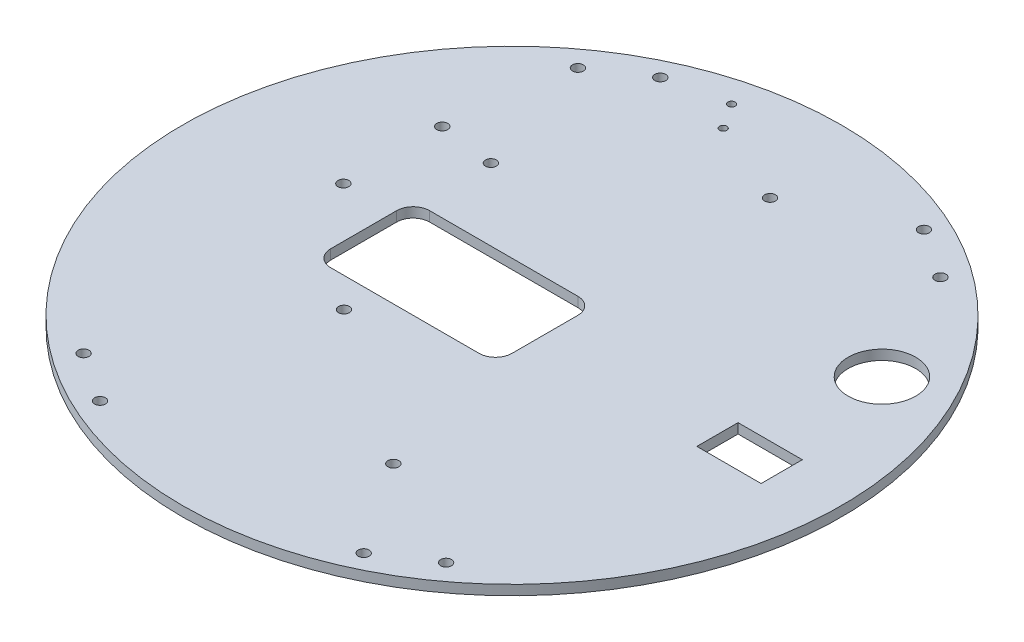
ISO-10303-21;
HEADER;
FILE_DESCRIPTION(('STEP AP214'),'2;1');
FILE_NAME('part.step','',(''),(''),'','','');
FILE_SCHEMA(('AUTOMOTIVE_DESIGN { 1 0 10303 214 1 1 1 1 }'));
ENDSEC;
DATA;
#1=APPLICATION_CONTEXT('core data for automotive mechanical design processes');
#2=APPLICATION_PROTOCOL_DEFINITION('international standard','automotive_design',2000,#1);
#3=PRODUCT_CONTEXT('',#1,'mechanical');
#4=PRODUCT('Part','Part','',(#3));
#5=PRODUCT_RELATED_PRODUCT_CATEGORY('part','',(#4));
#6=PRODUCT_DEFINITION_FORMATION('','',#4);
#7=PRODUCT_DEFINITION_CONTEXT('part definition',#1,'design');
#8=PRODUCT_DEFINITION('design','',#6,#7);
#9=PRODUCT_DEFINITION_SHAPE('','',#8);
#10=(LENGTH_UNIT() NAMED_UNIT(*) SI_UNIT(.MILLI.,.METRE.));
#11=(NAMED_UNIT(*) PLANE_ANGLE_UNIT() SI_UNIT($,.RADIAN.));
#12=(NAMED_UNIT(*) SI_UNIT($,.STERADIAN.) SOLID_ANGLE_UNIT());
#13=UNCERTAINTY_MEASURE_WITH_UNIT(LENGTH_MEASURE(1.E-05),#10,'distance_accuracy_value','');
#14=(GEOMETRIC_REPRESENTATION_CONTEXT(3) GLOBAL_UNCERTAINTY_ASSIGNED_CONTEXT((#13)) GLOBAL_UNIT_ASSIGNED_CONTEXT((#10,
#11,#12)) REPRESENTATION_CONTEXT('',''));
#15=CARTESIAN_POINT('',(0.,0.,0.));
#16=DIRECTION('',(0.,0.,1.));
#17=DIRECTION('',(1.,0.,0.));
#18=AXIS2_PLACEMENT_3D('',#15,#16,#17);
#19=CARTESIAN_POINT('',(0.,3.,0.));
#20=DIRECTION('',(0.,1.,0.));
#21=DIRECTION('',(0.,0.,1.));
#22=AXIS2_PLACEMENT_3D('',#19,#20,#21);
#23=PLANE('',#22);
#24=CARTESIAN_POINT('',(-22.1823925897006,3.,-88.81));
#25=DIRECTION('',(0.,1.,0.));
#26=DIRECTION('',(0.,0.,1.));
#27=AXIS2_PLACEMENT_3D('',#24,#25,#26);
#28=CIRCLE('',#27,1.1);
#29=CARTESIAN_POINT('',(-22.1823925897006,3.,-87.71));
#30=VERTEX_POINT('',#29);
#31=EDGE_CURVE('E172',#30,#30,#28,.T.);
#32=ORIENTED_EDGE('',*,*,#31,.F.);
#33=EDGE_LOOP('',(#32));
#34=FACE_BOUND('',#33,.T.);
#35=CARTESIAN_POINT('',(-40.0000000000001,3.,-85.));
#36=DIRECTION('',(0.,1.,0.));
#37=DIRECTION('',(0.,0.,1.));
#38=AXIS2_PLACEMENT_3D('',#35,#36,#37);
#39=CIRCLE('',#38,1.65);
#40=CARTESIAN_POINT('',(-40.0000000000001,3.,-83.35));
#41=VERTEX_POINT('',#40);
#42=EDGE_CURVE('E184',#41,#41,#39,.T.);
#43=ORIENTED_EDGE('',*,*,#42,.F.);
#44=EDGE_LOOP('',(#43));
#45=FACE_BOUND('',#44,.T.);
#46=CARTESIAN_POINT('',(55.,3.,-75.));
#47=DIRECTION('',(0.,1.,0.));
#48=DIRECTION('',(0.,0.,1.));
#49=AXIS2_PLACEMENT_3D('',#46,#47,#48);
#50=CIRCLE('',#49,1.65);
#51=CARTESIAN_POINT('',(55.,3.,-73.35));
#52=VERTEX_POINT('',#51);
#53=EDGE_CURVE('E196',#52,#52,#50,.T.);
#54=ORIENTED_EDGE('',*,*,#53,.F.);
#55=EDGE_LOOP('',(#54));
#56=FACE_BOUND('',#55,.T.);
#57=CARTESIAN_POINT('',(-43.2023925897006,3.,-36.8));
#58=DIRECTION('',(0.,1.,0.));
#59=DIRECTION('',(0.,0.,1.));
#60=AXIS2_PLACEMENT_3D('',#57,#58,#59);
#61=CIRCLE('',#60,1.65);
#62=CARTESIAN_POINT('',(-43.2023925897006,3.,-35.15));
#63=VERTEX_POINT('',#62);
#64=EDGE_CURVE('E267',#63,#63,#61,.T.);
#65=ORIENTED_EDGE('',*,*,#64,.F.);
#66=EDGE_LOOP('',(#65));
#67=FACE_BOUND('',#66,.T.);
#68=CARTESIAN_POINT('',(72.25,3.,-40.));
#69=DIRECTION('',(0.,1.,0.));
#70=DIRECTION('',(0.,0.,1.));
#71=AXIS2_PLACEMENT_3D('',#68,#69,#70);
#72=CIRCLE('',#71,10.25);
#73=CARTESIAN_POINT('',(72.25,3.,-29.75));
#74=VERTEX_POINT('',#73);
#75=EDGE_CURVE('E279',#74,#74,#72,.T.);
#76=ORIENTED_EDGE('',*,*,#75,.F.);
#77=EDGE_LOOP('',(#76));
#78=FACE_BOUND('',#77,.T.);
#79=CARTESIAN_POINT('',(-55.,3.,75.));
#80=DIRECTION('',(0.,1.,0.));
#81=DIRECTION('',(0.,0.,1.));
#82=AXIS2_PLACEMENT_3D('',#79,#80,#81);
#83=CIRCLE('',#82,1.65);
#84=CARTESIAN_POINT('',(-55.,3.,76.65));
#85=VERTEX_POINT('',#84);
#86=EDGE_CURVE('E291',#85,#85,#83,.T.);
#87=ORIENTED_EDGE('',*,*,#86,.F.);
#88=EDGE_LOOP('',(#87));
#89=FACE_BOUND('',#88,.T.);
#90=CARTESIAN_POINT('',(40.,3.,-85.));
#91=DIRECTION('',(0.,1.,0.));
#92=DIRECTION('',(0.,0.,-1.));
#93=AXIS2_PLACEMENT_3D('',#90,#91,#92);
#94=CIRCLE('',#93,1.65);
#95=CARTESIAN_POINT('',(40.,3.,-86.65));
#96=VERTEX_POINT('',#95);
#97=EDGE_CURVE('E303',#96,#96,#94,.T.);
#98=ORIENTED_EDGE('',*,*,#97,.F.);
#99=EDGE_LOOP('',(#98));
#100=FACE_BOUND('',#99,.T.);
#101=CARTESIAN_POINT('',(-60.2023925897006,3.,-39.0279795935003));
#102=DIRECTION('',(0.,1.,0.));
#103=DIRECTION('',(0.,0.,1.));
#104=AXIS2_PLACEMENT_3D('',#101,#102,#103);
#105=CIRCLE('',#104,1.65);
#106=CARTESIAN_POINT('',(-60.2023925897006,3.,-37.3779795935003));
#107=VERTEX_POINT('',#106);
#108=EDGE_CURVE('E315',#107,#107,#105,.T.);
#109=ORIENTED_EDGE('',*,*,#108,.F.);
#110=EDGE_LOOP('',(#109));
#111=FACE_BOUND('',#110,.T.);
#112=CARTESIAN_POINT('',(0.,3.,0.));
#113=DIRECTION('',(0.,1.,0.));
#114=DIRECTION('',(0.,0.,1.));
#115=AXIS2_PLACEMENT_3D('',#112,#113,#114);
#116=CIRCLE('',#115,100.);
#117=CARTESIAN_POINT('',(0.,3.,100.));
#118=VERTEX_POINT('',#117);
#119=EDGE_CURVE('E11',#118,#118,#116,.T.);
#120=ORIENTED_EDGE('',*,*,#119,.T.);
#121=EDGE_LOOP('',(#120));
#122=FACE_BOUND('',#121,.T.);
#123=CARTESIAN_POINT('',(40.,3.,85.));
#124=DIRECTION('',(0.,1.,0.));
#125=DIRECTION('',(0.,0.,1.));
#126=AXIS2_PLACEMENT_3D('',#123,#124,#125);
#127=CIRCLE('',#126,1.65);
#128=CARTESIAN_POINT('',(40.,3.,86.65));
#129=VERTEX_POINT('',#128);
#130=EDGE_CURVE('E321',#129,#129,#127,.T.);
#131=ORIENTED_EDGE('',*,*,#130,.F.);
#132=EDGE_LOOP('',(#131));
#133=FACE_BOUND('',#132,.T.);
#134=CARTESIAN_POINT('',(-60.2023925897006,3.,-9.02797959350035));
#135=DIRECTION('',(0.,1.,0.));
#136=DIRECTION('',(0.,0.,1.));
#137=AXIS2_PLACEMENT_3D('',#134,#135,#136);
#138=CIRCLE('',#137,1.64999999999997);
#139=CARTESIAN_POINT('',(-60.2023925897006,3.,-7.37797959350038));
#140=VERTEX_POINT('',#139);
#141=EDGE_CURVE('E309',#140,#140,#138,.T.);
#142=ORIENTED_EDGE('',*,*,#141,.F.);
#143=EDGE_LOOP('',(#142));
#144=FACE_BOUND('',#143,.T.);
#145=CARTESIAN_POINT('',(-40.,3.,85.));
#146=DIRECTION('',(0.,1.,0.));
#147=DIRECTION('',(0.,0.,-1.));
#148=AXIS2_PLACEMENT_3D('',#145,#146,#147);
#149=CIRCLE('',#148,1.65);
#150=CARTESIAN_POINT('',(-40.,3.,83.35));
#151=VERTEX_POINT('',#150);
#152=EDGE_CURVE('E297',#151,#151,#149,.T.);
#153=ORIENTED_EDGE('',*,*,#152,.F.);
#154=EDGE_LOOP('',(#153));
#155=FACE_BOUND('',#154,.T.);
#156=CARTESIAN_POINT('',(21.,3.,57.));
#157=DIRECTION('',(0.,1.,0.));
#158=DIRECTION('',(0.,0.,-1.));
#159=AXIS2_PLACEMENT_3D('',#156,#157,#158);
#160=CIRCLE('',#159,1.65);
#161=CARTESIAN_POINT('',(21.,3.,55.35));
#162=VERTEX_POINT('',#161);
#163=EDGE_CURVE('E285',#162,#162,#160,.T.);
#164=ORIENTED_EDGE('',*,*,#163,.F.);
#165=EDGE_LOOP('',(#164));
#166=FACE_BOUND('',#165,.T.);
#167=CARTESIAN_POINT('',(-27.,3.,24.));
#168=DIRECTION('',(0.,1.,0.));
#169=DIRECTION('',(0.,0.,-1.));
#170=AXIS2_PLACEMENT_3D('',#167,#168,#169);
#171=CIRCLE('',#170,1.65);
#172=CARTESIAN_POINT('',(-27.,3.,22.35));
#173=VERTEX_POINT('',#172);
#174=EDGE_CURVE('E273',#173,#173,#171,.T.);
#175=ORIENTED_EDGE('',*,*,#174,.F.);
#176=EDGE_LOOP('',(#175));
#177=FACE_BOUND('',#176,.T.);
#178=CARTESIAN_POINT('',(8.29760741029937,3.,-70.));
#179=DIRECTION('',(0.,1.,0.));
#180=DIRECTION('',(0.,0.,1.));
#181=AXIS2_PLACEMENT_3D('',#178,#179,#180);
#182=CIRCLE('',#181,1.65);
#183=CARTESIAN_POINT('',(8.29760741029937,3.,-68.35));
#184=VERTEX_POINT('',#183);
#185=EDGE_CURVE('E261',#184,#184,#182,.T.);
#186=ORIENTED_EDGE('',*,*,#185,.F.);
#187=EDGE_LOOP('',(#186));
#188=FACE_BOUND('',#187,.T.);
#189=DIRECTION('',(-1.,0.,0.));
#190=VECTOR('',#189,1.);
#191=CARTESIAN_POINT('',(-40.,3.,-15.));
#192=LINE('',#191,#190);
#193=CARTESIAN_POINT('',(5.,3.,-15.));
#194=VERTEX_POINT('',#193);
#195=CARTESIAN_POINT('',(-40.,3.,-15.));
#196=VERTEX_POINT('',#195);
#197=EDGE_CURVE('E204',#194,#196,#192,.T.);
#198=ORIENTED_EDGE('',*,*,#197,.F.);
#199=CARTESIAN_POINT('',(5.,3.,-10.));
#200=DIRECTION('',(0.,1.,0.));
#201=DIRECTION('',(0.,0.,-1.));
#202=AXIS2_PLACEMENT_3D('',#199,#200,#201);
#203=CIRCLE('',#202,5.);
#204=CARTESIAN_POINT('',(10.,3.,-10.));
#205=VERTEX_POINT('',#204);
#206=EDGE_CURVE('E202',#205,#194,#203,.T.);
#207=ORIENTED_EDGE('',*,*,#206,.F.);
#208=DIRECTION('',(0.,0.,-1.));
#209=VECTOR('',#208,1.);
#210=CARTESIAN_POINT('',(10.,3.,-10.));
#211=LINE('',#210,#209);
#212=CARTESIAN_POINT('',(10.,3.,10.));
#213=VERTEX_POINT('',#212);
#214=EDGE_CURVE('E218',#213,#205,#211,.T.);
#215=ORIENTED_EDGE('',*,*,#214,.F.);
#216=CARTESIAN_POINT('',(5.,3.,10.));
#217=DIRECTION('',(0.,1.,0.));
#218=DIRECTION('',(0.,0.,1.));
#219=AXIS2_PLACEMENT_3D('',#216,#217,#218);
#220=CIRCLE('',#219,5.);
#221=CARTESIAN_POINT('',(5.,3.,15.));
#222=VERTEX_POINT('',#221);
#223=EDGE_CURVE('E215',#222,#213,#220,.T.);
#224=ORIENTED_EDGE('',*,*,#223,.F.);
#225=DIRECTION('',(1.,0.,0.));
#226=VECTOR('',#225,1.);
#227=CARTESIAN_POINT('',(-40.,3.,15.));
#228=LINE('',#227,#226);
#229=CARTESIAN_POINT('',(-40.,3.,15.));
#230=VERTEX_POINT('',#229);
#231=EDGE_CURVE('E213',#230,#222,#228,.T.);
#232=ORIENTED_EDGE('',*,*,#231,.F.);
#233=CARTESIAN_POINT('',(-40.,3.,10.));
#234=DIRECTION('',(0.,1.,0.));
#235=DIRECTION('',(0.,0.,1.));
#236=AXIS2_PLACEMENT_3D('',#233,#234,#235);
#237=CIRCLE('',#236,5.);
#238=CARTESIAN_POINT('',(-45.,3.,10.));
#239=VERTEX_POINT('',#238);
#240=EDGE_CURVE('E211',#239,#230,#237,.T.);
#241=ORIENTED_EDGE('',*,*,#240,.F.);
#242=DIRECTION('',(0.,0.,1.));
#243=VECTOR('',#242,1.);
#244=CARTESIAN_POINT('',(-45.,3.,-10.));
#245=LINE('',#244,#243);
#246=CARTESIAN_POINT('',(-45.,3.,-10.));
#247=VERTEX_POINT('',#246);
#248=EDGE_CURVE('E209',#247,#239,#245,.T.);
#249=ORIENTED_EDGE('',*,*,#248,.F.);
#250=CARTESIAN_POINT('',(-40.,3.,-10.));
#251=DIRECTION('',(0.,1.,0.));
#252=DIRECTION('',(0.,0.,1.));
#253=AXIS2_PLACEMENT_3D('',#250,#251,#252);
#254=CIRCLE('',#253,5.);
#255=EDGE_CURVE('E207',#196,#247,#254,.T.);
#256=ORIENTED_EDGE('',*,*,#255,.F.);
#257=EDGE_LOOP('',(#198,#207,#215,#224,#232,#241,#249,#256));
#258=FACE_BOUND('',#257,.T.);
#259=CARTESIAN_POINT('',(-55.,3.,-75.));
#260=DIRECTION('',(0.,1.,0.));
#261=DIRECTION('',(0.,0.,-1.));
#262=AXIS2_PLACEMENT_3D('',#259,#260,#261);
#263=CIRCLE('',#262,1.65);
#264=CARTESIAN_POINT('',(-55.,3.,-76.65));
#265=VERTEX_POINT('',#264);
#266=EDGE_CURVE('E190',#265,#265,#263,.T.);
#267=ORIENTED_EDGE('',*,*,#266,.F.);
#268=EDGE_LOOP('',(#267));
#269=FACE_BOUND('',#268,.T.);
#270=CARTESIAN_POINT('',(55.,3.,75.));
#271=DIRECTION('',(0.,1.,0.));
#272=DIRECTION('',(0.,0.,-1.));
#273=AXIS2_PLACEMENT_3D('',#270,#271,#272);
#274=CIRCLE('',#273,1.65);
#275=CARTESIAN_POINT('',(55.,3.,73.35));
#276=VERTEX_POINT('',#275);
#277=EDGE_CURVE('E178',#276,#276,#274,.T.);
#278=ORIENTED_EDGE('',*,*,#277,.F.);
#279=EDGE_LOOP('',(#278));
#280=FACE_BOUND('',#279,.T.);
#281=CARTESIAN_POINT('',(-17.1023925897006,3.,-81.19));
#282=DIRECTION('',(0.,1.,0.));
#283=DIRECTION('',(0.,0.,1.));
#284=AXIS2_PLACEMENT_3D('',#281,#282,#283);
#285=CIRCLE('',#284,1.1);
#286=CARTESIAN_POINT('',(-17.1023925897006,3.,-80.09));
#287=VERTEX_POINT('',#286);
#288=EDGE_CURVE('E166',#287,#287,#285,.T.);
#289=ORIENTED_EDGE('',*,*,#288,.F.);
#290=EDGE_LOOP('',(#289));
#291=FACE_BOUND('',#290,.T.);
#292=DIRECTION('',(1.,0.,0.));
#293=VECTOR('',#292,1.);
#294=CARTESIAN_POINT('',(62.5,3.,6.40853409758088));
#295=LINE('',#294,#293);
#296=CARTESIAN_POINT('',(62.5,3.,6.40853409758088));
#297=VERTEX_POINT('',#296);
#298=CARTESIAN_POINT('',(82.,3.,6.40853409758088));
#299=VERTEX_POINT('',#298);
#300=EDGE_CURVE('E138',#297,#299,#295,.T.);
#301=ORIENTED_EDGE('',*,*,#300,.F.);
#302=DIRECTION('',(0.,0.,1.));
#303=VECTOR('',#302,1.);
#304=CARTESIAN_POINT('',(62.5,3.,-6.09146590241912));
#305=LINE('',#304,#303);
#306=CARTESIAN_POINT('',(62.5,3.,-6.09146590241912));
#307=VERTEX_POINT('',#306);
#308=EDGE_CURVE('E130',#307,#297,#305,.T.);
#309=ORIENTED_EDGE('',*,*,#308,.F.);
#310=DIRECTION('',(-1.,0.,0.));
#311=VECTOR('',#310,1.);
#312=CARTESIAN_POINT('',(62.5,3.,-6.09146590241912));
#313=LINE('',#312,#311);
#314=CARTESIAN_POINT('',(82.,3.,-6.09146590241912));
#315=VERTEX_POINT('',#314);
#316=EDGE_CURVE('E152',#315,#307,#313,.T.);
#317=ORIENTED_EDGE('',*,*,#316,.F.);
#318=DIRECTION('',(0.,0.,-1.));
#319=VECTOR('',#318,1.);
#320=CARTESIAN_POINT('',(82.,3.,-6.09146590241912));
#321=LINE('',#320,#319);
#322=EDGE_CURVE('E150',#299,#315,#321,.T.);
#323=ORIENTED_EDGE('',*,*,#322,.F.);
#324=EDGE_LOOP('',(#301,#309,#317,#323));
#325=FACE_BOUND('',#324,.T.);
#326=ADVANCED_FACE('F41',(#34,#45,#56,#67,#78,#89,#100,#111,#122,#133,#144,#155,#166,#177,#188,
#258,#269,#280,#291,#325),#23,.T.);
#327=CARTESIAN_POINT('',(0.,0.,0.));
#328=DIRECTION('',(0.,1.,0.));
#329=DIRECTION('',(0.,0.,1.));
#330=AXIS2_PLACEMENT_3D('',#327,#328,#329);
#331=PLANE('',#330);
#332=CARTESIAN_POINT('',(-17.1023925897006,0.,-81.19));
#333=DIRECTION('',(0.,1.,0.));
#334=DIRECTION('',(0.,0.,1.));
#335=AXIS2_PLACEMENT_3D('',#332,#333,#334);
#336=CIRCLE('',#335,1.1);
#337=CARTESIAN_POINT('',(-17.1023925897006,0.,-80.09));
#338=VERTEX_POINT('',#337);
#339=EDGE_CURVE('E146',#338,#338,#336,.T.);
#340=ORIENTED_EDGE('',*,*,#339,.T.);
#341=EDGE_LOOP('',(#340));
#342=FACE_BOUND('',#341,.T.);
#343=CARTESIAN_POINT('',(-22.1823925897006,0.,-88.81));
#344=DIRECTION('',(0.,1.,0.));
#345=DIRECTION('',(0.,0.,1.));
#346=AXIS2_PLACEMENT_3D('',#343,#344,#345);
#347=CIRCLE('',#346,1.1);
#348=CARTESIAN_POINT('',(-22.1823925897006,0.,-87.71));
#349=VERTEX_POINT('',#348);
#350=EDGE_CURVE('E169',#349,#349,#347,.T.);
#351=ORIENTED_EDGE('',*,*,#350,.T.);
#352=EDGE_LOOP('',(#351));
#353=FACE_BOUND('',#352,.T.);
#354=CARTESIAN_POINT('',(55.,0.,75.));
#355=DIRECTION('',(0.,1.,0.));
#356=DIRECTION('',(0.,0.,-1.));
#357=AXIS2_PLACEMENT_3D('',#354,#355,#356);
#358=CIRCLE('',#357,1.65);
#359=CARTESIAN_POINT('',(55.,0.,73.35));
#360=VERTEX_POINT('',#359);
#361=EDGE_CURVE('E175',#360,#360,#358,.T.);
#362=ORIENTED_EDGE('',*,*,#361,.T.);
#363=EDGE_LOOP('',(#362));
#364=FACE_BOUND('',#363,.T.);
#365=CARTESIAN_POINT('',(-40.0000000000001,0.,-85.));
#366=DIRECTION('',(0.,1.,0.));
#367=DIRECTION('',(0.,0.,1.));
#368=AXIS2_PLACEMENT_3D('',#365,#366,#367);
#369=CIRCLE('',#368,1.65);
#370=CARTESIAN_POINT('',(-40.0000000000001,0.,-83.35));
#371=VERTEX_POINT('',#370);
#372=EDGE_CURVE('E181',#371,#371,#369,.T.);
#373=ORIENTED_EDGE('',*,*,#372,.T.);
#374=EDGE_LOOP('',(#373));
#375=FACE_BOUND('',#374,.T.);
#376=CARTESIAN_POINT('',(-55.,0.,-75.));
#377=DIRECTION('',(0.,1.,0.));
#378=DIRECTION('',(0.,0.,-1.));
#379=AXIS2_PLACEMENT_3D('',#376,#377,#378);
#380=CIRCLE('',#379,1.65);
#381=CARTESIAN_POINT('',(-55.,0.,-76.65));
#382=VERTEX_POINT('',#381);
#383=EDGE_CURVE('E187',#382,#382,#380,.T.);
#384=ORIENTED_EDGE('',*,*,#383,.T.);
#385=EDGE_LOOP('',(#384));
#386=FACE_BOUND('',#385,.T.);
#387=CARTESIAN_POINT('',(55.,0.,-75.));
#388=DIRECTION('',(0.,1.,0.));
#389=DIRECTION('',(0.,0.,1.));
#390=AXIS2_PLACEMENT_3D('',#387,#388,#389);
#391=CIRCLE('',#390,1.65);
#392=CARTESIAN_POINT('',(55.,0.,-73.35));
#393=VERTEX_POINT('',#392);
#394=EDGE_CURVE('E193',#393,#393,#391,.T.);
#395=ORIENTED_EDGE('',*,*,#394,.T.);
#396=EDGE_LOOP('',(#395));
#397=FACE_BOUND('',#396,.T.);
#398=CARTESIAN_POINT('',(5.,0.,-10.));
#399=DIRECTION('',(0.,1.,0.));
#400=DIRECTION('',(0.,0.,-1.));
#401=AXIS2_PLACEMENT_3D('',#398,#399,#400);
#402=CIRCLE('',#401,5.);
#403=CARTESIAN_POINT('',(10.,0.,-10.));
#404=VERTEX_POINT('',#403);
#405=CARTESIAN_POINT('',(5.,0.,-15.));
#406=VERTEX_POINT('',#405);
#407=EDGE_CURVE('E199',#404,#406,#402,.T.);
#408=ORIENTED_EDGE('',*,*,#407,.T.);
#409=DIRECTION('',(-1.,0.,0.));
#410=VECTOR('',#409,1.);
#411=CARTESIAN_POINT('',(-40.,0.,-15.));
#412=LINE('',#411,#410);
#413=CARTESIAN_POINT('',(-40.,0.,-15.));
#414=VERTEX_POINT('',#413);
#415=EDGE_CURVE('E223',#406,#414,#412,.T.);
#416=ORIENTED_EDGE('',*,*,#415,.T.);
#417=CARTESIAN_POINT('',(-40.,0.,-10.));
#418=DIRECTION('',(0.,1.,0.));
#419=DIRECTION('',(0.,0.,1.));
#420=AXIS2_PLACEMENT_3D('',#417,#418,#419);
#421=CIRCLE('',#420,5.);
#422=CARTESIAN_POINT('',(-45.,0.,-10.));
#423=VERTEX_POINT('',#422);
#424=EDGE_CURVE('E226',#414,#423,#421,.T.);
#425=ORIENTED_EDGE('',*,*,#424,.T.);
#426=DIRECTION('',(0.,0.,1.));
#427=VECTOR('',#426,1.);
#428=CARTESIAN_POINT('',(-45.,0.,-10.));
#429=LINE('',#428,#427);
#430=CARTESIAN_POINT('',(-45.,0.,10.));
#431=VERTEX_POINT('',#430);
#432=EDGE_CURVE('E229',#423,#431,#429,.T.);
#433=ORIENTED_EDGE('',*,*,#432,.T.);
#434=CARTESIAN_POINT('',(-40.,0.,10.));
#435=DIRECTION('',(0.,1.,0.));
#436=DIRECTION('',(0.,0.,1.));
#437=AXIS2_PLACEMENT_3D('',#434,#435,#436);
#438=CIRCLE('',#437,5.);
#439=CARTESIAN_POINT('',(-40.,0.,15.));
#440=VERTEX_POINT('',#439);
#441=EDGE_CURVE('E232',#431,#440,#438,.T.);
#442=ORIENTED_EDGE('',*,*,#441,.T.);
#443=DIRECTION('',(1.,0.,0.));
#444=VECTOR('',#443,1.);
#445=CARTESIAN_POINT('',(-40.,0.,15.));
#446=LINE('',#445,#444);
#447=CARTESIAN_POINT('',(5.,0.,15.));
#448=VERTEX_POINT('',#447);
#449=EDGE_CURVE('E235',#440,#448,#446,.T.);
#450=ORIENTED_EDGE('',*,*,#449,.T.);
#451=CARTESIAN_POINT('',(5.,0.,10.));
#452=DIRECTION('',(0.,1.,0.));
#453=DIRECTION('',(0.,0.,1.));
#454=AXIS2_PLACEMENT_3D('',#451,#452,#453);
#455=CIRCLE('',#454,5.);
#456=CARTESIAN_POINT('',(10.,0.,10.));
#457=VERTEX_POINT('',#456);
#458=EDGE_CURVE('E238',#448,#457,#455,.T.);
#459=ORIENTED_EDGE('',*,*,#458,.T.);
#460=DIRECTION('',(0.,0.,-1.));
#461=VECTOR('',#460,1.);
#462=CARTESIAN_POINT('',(10.,0.,-10.));
#463=LINE('',#462,#461);
#464=EDGE_CURVE('E205',#457,#404,#463,.T.);
#465=ORIENTED_EDGE('',*,*,#464,.T.);
#466=EDGE_LOOP('',(#408,#416,#425,#433,#442,#450,#459,#465));
#467=FACE_BOUND('',#466,.T.);
#468=CARTESIAN_POINT('',(0.,0.,0.));
#469=DIRECTION('',(0.,1.,0.));
#470=DIRECTION('',(0.,0.,1.));
#471=AXIS2_PLACEMENT_3D('',#468,#469,#470);
#472=CIRCLE('',#471,100.);
#473=CARTESIAN_POINT('',(0.,0.,100.));
#474=VERTEX_POINT('',#473);
#475=EDGE_CURVE('E45',#474,#474,#472,.T.);
#476=ORIENTED_EDGE('',*,*,#475,.F.);
#477=EDGE_LOOP('',(#476));
#478=FACE_BOUND('',#477,.T.);
#479=CARTESIAN_POINT('',(40.,0.,85.));
#480=DIRECTION('',(0.,1.,0.));
#481=DIRECTION('',(0.,0.,1.));
#482=AXIS2_PLACEMENT_3D('',#479,#480,#481);
#483=CIRCLE('',#482,1.65);
#484=CARTESIAN_POINT('',(40.,0.,86.65));
#485=VERTEX_POINT('',#484);
#486=EDGE_CURVE('E318',#485,#485,#483,.T.);
#487=ORIENTED_EDGE('',*,*,#486,.T.);
#488=EDGE_LOOP('',(#487));
#489=FACE_BOUND('',#488,.T.);
#490=CARTESIAN_POINT('',(-60.2023925897006,0.,-39.0279795935003));
#491=DIRECTION('',(0.,1.,0.));
#492=DIRECTION('',(0.,0.,1.));
#493=AXIS2_PLACEMENT_3D('',#490,#491,#492);
#494=CIRCLE('',#493,1.65);
#495=CARTESIAN_POINT('',(-60.2023925897006,0.,-37.3779795935003));
#496=VERTEX_POINT('',#495);
#497=EDGE_CURVE('E312',#496,#496,#494,.T.);
#498=ORIENTED_EDGE('',*,*,#497,.T.);
#499=EDGE_LOOP('',(#498));
#500=FACE_BOUND('',#499,.T.);
#501=CARTESIAN_POINT('',(-60.2023925897006,0.,-9.02797959350035));
#502=DIRECTION('',(0.,1.,0.));
#503=DIRECTION('',(0.,0.,1.));
#504=AXIS2_PLACEMENT_3D('',#501,#502,#503);
#505=CIRCLE('',#504,1.64999999999997);
#506=CARTESIAN_POINT('',(-60.2023925897006,0.,-7.37797959350038));
#507=VERTEX_POINT('',#506);
#508=EDGE_CURVE('E306',#507,#507,#505,.T.);
#509=ORIENTED_EDGE('',*,*,#508,.T.);
#510=EDGE_LOOP('',(#509));
#511=FACE_BOUND('',#510,.T.);
#512=CARTESIAN_POINT('',(40.,0.,-85.));
#513=DIRECTION('',(0.,1.,0.));
#514=DIRECTION('',(0.,0.,-1.));
#515=AXIS2_PLACEMENT_3D('',#512,#513,#514);
#516=CIRCLE('',#515,1.65);
#517=CARTESIAN_POINT('',(40.,0.,-86.65));
#518=VERTEX_POINT('',#517);
#519=EDGE_CURVE('E300',#518,#518,#516,.T.);
#520=ORIENTED_EDGE('',*,*,#519,.T.);
#521=EDGE_LOOP('',(#520));
#522=FACE_BOUND('',#521,.T.);
#523=CARTESIAN_POINT('',(-40.,0.,85.));
#524=DIRECTION('',(0.,1.,0.));
#525=DIRECTION('',(0.,0.,-1.));
#526=AXIS2_PLACEMENT_3D('',#523,#524,#525);
#527=CIRCLE('',#526,1.65);
#528=CARTESIAN_POINT('',(-40.,0.,83.35));
#529=VERTEX_POINT('',#528);
#530=EDGE_CURVE('E294',#529,#529,#527,.T.);
#531=ORIENTED_EDGE('',*,*,#530,.T.);
#532=EDGE_LOOP('',(#531));
#533=FACE_BOUND('',#532,.T.);
#534=CARTESIAN_POINT('',(-55.,0.,75.));
#535=DIRECTION('',(0.,1.,0.));
#536=DIRECTION('',(0.,0.,1.));
#537=AXIS2_PLACEMENT_3D('',#534,#535,#536);
#538=CIRCLE('',#537,1.65);
#539=CARTESIAN_POINT('',(-55.,0.,76.65));
#540=VERTEX_POINT('',#539);
#541=EDGE_CURVE('E288',#540,#540,#538,.T.);
#542=ORIENTED_EDGE('',*,*,#541,.T.);
#543=EDGE_LOOP('',(#542));
#544=FACE_BOUND('',#543,.T.);
#545=CARTESIAN_POINT('',(21.,0.,57.));
#546=DIRECTION('',(0.,1.,0.));
#547=DIRECTION('',(0.,0.,-1.));
#548=AXIS2_PLACEMENT_3D('',#545,#546,#547);
#549=CIRCLE('',#548,1.65);
#550=CARTESIAN_POINT('',(21.,0.,55.35));
#551=VERTEX_POINT('',#550);
#552=EDGE_CURVE('E282',#551,#551,#549,.T.);
#553=ORIENTED_EDGE('',*,*,#552,.T.);
#554=EDGE_LOOP('',(#553));
#555=FACE_BOUND('',#554,.T.);
#556=CARTESIAN_POINT('',(72.25,0.,-40.));
#557=DIRECTION('',(0.,1.,0.));
#558=DIRECTION('',(0.,0.,1.));
#559=AXIS2_PLACEMENT_3D('',#556,#557,#558);
#560=CIRCLE('',#559,10.25);
#561=CARTESIAN_POINT('',(72.25,0.,-29.75));
#562=VERTEX_POINT('',#561);
#563=EDGE_CURVE('E276',#562,#562,#560,.T.);
#564=ORIENTED_EDGE('',*,*,#563,.T.);
#565=EDGE_LOOP('',(#564));
#566=FACE_BOUND('',#565,.T.);
#567=CARTESIAN_POINT('',(-27.,0.,24.));
#568=DIRECTION('',(0.,1.,0.));
#569=DIRECTION('',(0.,0.,-1.));
#570=AXIS2_PLACEMENT_3D('',#567,#568,#569);
#571=CIRCLE('',#570,1.65);
#572=CARTESIAN_POINT('',(-27.,0.,22.35));
#573=VERTEX_POINT('',#572);
#574=EDGE_CURVE('E270',#573,#573,#571,.T.);
#575=ORIENTED_EDGE('',*,*,#574,.T.);
#576=EDGE_LOOP('',(#575));
#577=FACE_BOUND('',#576,.T.);
#578=CARTESIAN_POINT('',(-43.2023925897006,0.,-36.8));
#579=DIRECTION('',(0.,1.,0.));
#580=DIRECTION('',(0.,0.,1.));
#581=AXIS2_PLACEMENT_3D('',#578,#579,#580);
#582=CIRCLE('',#581,1.65);
#583=CARTESIAN_POINT('',(-43.2023925897006,0.,-35.15));
#584=VERTEX_POINT('',#583);
#585=EDGE_CURVE('E264',#584,#584,#582,.T.);
#586=ORIENTED_EDGE('',*,*,#585,.T.);
#587=EDGE_LOOP('',(#586));
#588=FACE_BOUND('',#587,.T.);
#589=CARTESIAN_POINT('',(8.29760741029937,0.,-70.));
#590=DIRECTION('',(0.,1.,0.));
#591=DIRECTION('',(0.,0.,1.));
#592=AXIS2_PLACEMENT_3D('',#589,#590,#591);
#593=CIRCLE('',#592,1.65);
#594=CARTESIAN_POINT('',(8.29760741029937,0.,-68.35));
#595=VERTEX_POINT('',#594);
#596=EDGE_CURVE('E260',#595,#595,#593,.T.);
#597=ORIENTED_EDGE('',*,*,#596,.T.);
#598=EDGE_LOOP('',(#597));
#599=FACE_BOUND('',#598,.T.);
#600=DIRECTION('',(0.,0.,1.));
#601=VECTOR('',#600,1.);
#602=CARTESIAN_POINT('',(62.5,0.,-6.09146590241912));
#603=LINE('',#602,#601);
#604=CARTESIAN_POINT('',(62.5,0.,-6.09146590241912));
#605=VERTEX_POINT('',#604);
#606=CARTESIAN_POINT('',(62.5,0.,6.40853409758088));
#607=VERTEX_POINT('',#606);
#608=EDGE_CURVE('E64',#605,#607,#603,.T.);
#609=ORIENTED_EDGE('',*,*,#608,.T.);
#610=DIRECTION('',(1.,0.,0.));
#611=VECTOR('',#610,1.);
#612=CARTESIAN_POINT('',(62.5,0.,6.40853409758088));
#613=LINE('',#612,#611);
#614=CARTESIAN_POINT('',(82.,0.,6.40853409758088));
#615=VERTEX_POINT('',#614);
#616=EDGE_CURVE('E145',#607,#615,#613,.T.);
#617=ORIENTED_EDGE('',*,*,#616,.T.);
#618=DIRECTION('',(0.,0.,-1.));
#619=VECTOR('',#618,1.);
#620=CARTESIAN_POINT('',(82.,0.,-6.09146590241912));
#621=LINE('',#620,#619);
#622=CARTESIAN_POINT('',(82.,0.,-6.09146590241912));
#623=VERTEX_POINT('',#622);
#624=EDGE_CURVE('E158',#615,#623,#621,.T.);
#625=ORIENTED_EDGE('',*,*,#624,.T.);
#626=DIRECTION('',(-1.,0.,0.));
#627=VECTOR('',#626,1.);
#628=CARTESIAN_POINT('',(62.5,0.,-6.09146590241912));
#629=LINE('',#628,#627);
#630=EDGE_CURVE('E139',#623,#605,#629,.T.);
#631=ORIENTED_EDGE('',*,*,#630,.T.);
#632=EDGE_LOOP('',(#609,#617,#625,#631));
#633=FACE_BOUND('',#632,.T.);
#634=ADVANCED_FACE('F327',(#342,#353,#364,#375,#386,#397,#467,#478,#489,#500,#511,#522,#533,
#544,#555,#566,#577,#588,#599,#633),#331,.F.);
#635=CARTESIAN_POINT('',(0.,3.,0.));
#636=DIRECTION('',(0.,-1.,0.));
#637=DIRECTION('',(0.,0.,-1.));
#638=AXIS2_PLACEMENT_3D('',#635,#636,#637);
#639=CYLINDRICAL_SURFACE('',#638,100.);
#640=ORIENTED_EDGE('',*,*,#119,.F.);
#641=EDGE_LOOP('',(#640));
#642=FACE_BOUND('',#641,.T.);
#643=ORIENTED_EDGE('',*,*,#475,.T.);
#644=EDGE_LOOP('',(#643));
#645=FACE_BOUND('',#644,.T.);
#646=ADVANCED_FACE('F43',(#642,#645),#639,.T.);
#647=CARTESIAN_POINT('',(40.,3.,85.));
#648=DIRECTION('',(0.,-1.,0.));
#649=DIRECTION('',(0.,0.,-1.));
#650=AXIS2_PLACEMENT_3D('',#647,#648,#649);
#651=CYLINDRICAL_SURFACE('',#650,1.65);
#652=ORIENTED_EDGE('',*,*,#130,.T.);
#653=EDGE_LOOP('',(#652));
#654=FACE_BOUND('',#653,.T.);
#655=ORIENTED_EDGE('',*,*,#486,.F.);
#656=EDGE_LOOP('',(#655));
#657=FACE_BOUND('',#656,.T.);
#658=ADVANCED_FACE('F330',(#654,#657),#651,.F.);
#659=CARTESIAN_POINT('',(-60.2023925897006,3.,-39.0279795935003));
#660=DIRECTION('',(0.,-1.,0.));
#661=DIRECTION('',(0.,0.,-1.));
#662=AXIS2_PLACEMENT_3D('',#659,#660,#661);
#663=CYLINDRICAL_SURFACE('',#662,1.65);
#664=ORIENTED_EDGE('',*,*,#108,.T.);
#665=EDGE_LOOP('',(#664));
#666=FACE_BOUND('',#665,.T.);
#667=ORIENTED_EDGE('',*,*,#497,.F.);
#668=EDGE_LOOP('',(#667));
#669=FACE_BOUND('',#668,.T.);
#670=ADVANCED_FACE('F332',(#666,#669),#663,.F.);
#671=CARTESIAN_POINT('',(-60.2023925897006,3.,-9.02797959350035));
#672=DIRECTION('',(0.,-1.,0.));
#673=DIRECTION('',(0.,0.,-1.));
#674=AXIS2_PLACEMENT_3D('',#671,#672,#673);
#675=CYLINDRICAL_SURFACE('',#674,1.64999999999997);
#676=ORIENTED_EDGE('',*,*,#141,.T.);
#677=EDGE_LOOP('',(#676));
#678=FACE_BOUND('',#677,.T.);
#679=ORIENTED_EDGE('',*,*,#508,.F.);
#680=EDGE_LOOP('',(#679));
#681=FACE_BOUND('',#680,.T.);
#682=ADVANCED_FACE('F339',(#678,#681),#675,.F.);
#683=CARTESIAN_POINT('',(40.,3.,-85.));
#684=DIRECTION('',(0.,-1.,0.));
#685=DIRECTION('',(0.,0.,-1.));
#686=AXIS2_PLACEMENT_3D('',#683,#684,#685);
#687=CYLINDRICAL_SURFACE('',#686,1.65);
#688=ORIENTED_EDGE('',*,*,#97,.T.);
#689=EDGE_LOOP('',(#688));
#690=FACE_BOUND('',#689,.T.);
#691=ORIENTED_EDGE('',*,*,#519,.F.);
#692=EDGE_LOOP('',(#691));
#693=FACE_BOUND('',#692,.T.);
#694=ADVANCED_FACE('F493',(#690,#693),#687,.F.);
#695=CARTESIAN_POINT('',(-40.,3.,85.));
#696=DIRECTION('',(0.,-1.,0.));
#697=DIRECTION('',(0.,0.,-1.));
#698=AXIS2_PLACEMENT_3D('',#695,#696,#697);
#699=CYLINDRICAL_SURFACE('',#698,1.65);
#700=ORIENTED_EDGE('',*,*,#152,.T.);
#701=EDGE_LOOP('',(#700));
#702=FACE_BOUND('',#701,.T.);
#703=ORIENTED_EDGE('',*,*,#530,.F.);
#704=EDGE_LOOP('',(#703));
#705=FACE_BOUND('',#704,.T.);
#706=ADVANCED_FACE('F489',(#702,#705),#699,.F.);
#707=CARTESIAN_POINT('',(-55.,3.,75.));
#708=DIRECTION('',(0.,-1.,0.));
#709=DIRECTION('',(0.,0.,-1.));
#710=AXIS2_PLACEMENT_3D('',#707,#708,#709);
#711=CYLINDRICAL_SURFACE('',#710,1.65);
#712=ORIENTED_EDGE('',*,*,#86,.T.);
#713=EDGE_LOOP('',(#712));
#714=FACE_BOUND('',#713,.T.);
#715=ORIENTED_EDGE('',*,*,#541,.F.);
#716=EDGE_LOOP('',(#715));
#717=FACE_BOUND('',#716,.T.);
#718=ADVANCED_FACE('F485',(#714,#717),#711,.F.);
#719=CARTESIAN_POINT('',(21.,3.,57.));
#720=DIRECTION('',(0.,-1.,0.));
#721=DIRECTION('',(0.,0.,-1.));
#722=AXIS2_PLACEMENT_3D('',#719,#720,#721);
#723=CYLINDRICAL_SURFACE('',#722,1.65);
#724=ORIENTED_EDGE('',*,*,#163,.T.);
#725=EDGE_LOOP('',(#724));
#726=FACE_BOUND('',#725,.T.);
#727=ORIENTED_EDGE('',*,*,#552,.F.);
#728=EDGE_LOOP('',(#727));
#729=FACE_BOUND('',#728,.T.);
#730=ADVANCED_FACE('F481',(#726,#729),#723,.F.);
#731=CARTESIAN_POINT('',(72.25,3.,-40.));
#732=DIRECTION('',(0.,-1.,0.));
#733=DIRECTION('',(0.,0.,-1.));
#734=AXIS2_PLACEMENT_3D('',#731,#732,#733);
#735=CYLINDRICAL_SURFACE('',#734,10.25);
#736=ORIENTED_EDGE('',*,*,#75,.T.);
#737=EDGE_LOOP('',(#736));
#738=FACE_BOUND('',#737,.T.);
#739=ORIENTED_EDGE('',*,*,#563,.F.);
#740=EDGE_LOOP('',(#739));
#741=FACE_BOUND('',#740,.T.);
#742=ADVANCED_FACE('F477',(#738,#741),#735,.F.);
#743=CARTESIAN_POINT('',(-27.,3.,24.));
#744=DIRECTION('',(0.,-1.,0.));
#745=DIRECTION('',(0.,0.,-1.));
#746=AXIS2_PLACEMENT_3D('',#743,#744,#745);
#747=CYLINDRICAL_SURFACE('',#746,1.65);
#748=ORIENTED_EDGE('',*,*,#174,.T.);
#749=EDGE_LOOP('',(#748));
#750=FACE_BOUND('',#749,.T.);
#751=ORIENTED_EDGE('',*,*,#574,.F.);
#752=EDGE_LOOP('',(#751));
#753=FACE_BOUND('',#752,.T.);
#754=ADVANCED_FACE('F473',(#750,#753),#747,.F.);
#755=CARTESIAN_POINT('',(-43.2023925897006,3.,-36.8));
#756=DIRECTION('',(0.,-1.,0.));
#757=DIRECTION('',(0.,0.,-1.));
#758=AXIS2_PLACEMENT_3D('',#755,#756,#757);
#759=CYLINDRICAL_SURFACE('',#758,1.65);
#760=ORIENTED_EDGE('',*,*,#64,.T.);
#761=EDGE_LOOP('',(#760));
#762=FACE_BOUND('',#761,.T.);
#763=ORIENTED_EDGE('',*,*,#585,.F.);
#764=EDGE_LOOP('',(#763));
#765=FACE_BOUND('',#764,.T.);
#766=ADVANCED_FACE('F469',(#762,#765),#759,.F.);
#767=CARTESIAN_POINT('',(8.29760741029937,3.,-70.));
#768=DIRECTION('',(0.,-1.,0.));
#769=DIRECTION('',(0.,0.,-1.));
#770=AXIS2_PLACEMENT_3D('',#767,#768,#769);
#771=CYLINDRICAL_SURFACE('',#770,1.65);
#772=ORIENTED_EDGE('',*,*,#185,.T.);
#773=EDGE_LOOP('',(#772));
#774=FACE_BOUND('',#773,.T.);
#775=ORIENTED_EDGE('',*,*,#596,.F.);
#776=EDGE_LOOP('',(#775));
#777=FACE_BOUND('',#776,.T.);
#778=ADVANCED_FACE('F466',(#774,#777),#771,.F.);
#779=CARTESIAN_POINT('',(5.,3.,-10.));
#780=DIRECTION('',(0.,-1.,0.));
#781=DIRECTION('',(0.,0.,-1.));
#782=AXIS2_PLACEMENT_3D('',#779,#780,#781);
#783=CYLINDRICAL_SURFACE('',#782,5.);
#784=ORIENTED_EDGE('',*,*,#407,.F.);
#785=DIRECTION('',(0.,-1.,0.));
#786=VECTOR('',#785,1.);
#787=CARTESIAN_POINT('',(10.,3.,-10.));
#788=LINE('',#787,#786);
#789=EDGE_CURVE('E220',#205,#404,#788,.T.);
#790=ORIENTED_EDGE('',*,*,#789,.F.);
#791=ORIENTED_EDGE('',*,*,#206,.T.);
#792=DIRECTION('',(0.,-1.,0.));
#793=VECTOR('',#792,1.);
#794=CARTESIAN_POINT('',(5.,3.,-15.));
#795=LINE('',#794,#793);
#796=EDGE_CURVE('E257',#194,#406,#795,.T.);
#797=ORIENTED_EDGE('',*,*,#796,.T.);
#798=EDGE_LOOP('',(#784,#790,#791,#797));
#799=FACE_BOUND('',#798,.T.);
#800=ADVANCED_FACE('F414',(#799),#783,.F.);
#801=CARTESIAN_POINT('',(-40.,3.,-15.));
#802=DIRECTION('',(0.,0.,1.));
#803=DIRECTION('',(1.,0.,0.));
#804=AXIS2_PLACEMENT_3D('',#801,#802,#803);
#805=PLANE('',#804);
#806=ORIENTED_EDGE('',*,*,#415,.F.);
#807=ORIENTED_EDGE('',*,*,#796,.F.);
#808=ORIENTED_EDGE('',*,*,#197,.T.);
#809=DIRECTION('',(0.,-1.,0.));
#810=VECTOR('',#809,1.);
#811=CARTESIAN_POINT('',(-40.,3.,-15.));
#812=LINE('',#811,#810);
#813=EDGE_CURVE('E255',#196,#414,#812,.T.);
#814=ORIENTED_EDGE('',*,*,#813,.T.);
#815=EDGE_LOOP('',(#806,#807,#808,#814));
#816=FACE_BOUND('',#815,.T.);
#817=ADVANCED_FACE('F422',(#816),#805,.T.);
#818=CARTESIAN_POINT('',(-40.,3.,-10.));
#819=DIRECTION('',(0.,-1.,0.));
#820=DIRECTION('',(0.,0.,-1.));
#821=AXIS2_PLACEMENT_3D('',#818,#819,#820);
#822=CYLINDRICAL_SURFACE('',#821,5.);
#823=ORIENTED_EDGE('',*,*,#424,.F.);
#824=ORIENTED_EDGE('',*,*,#813,.F.);
#825=ORIENTED_EDGE('',*,*,#255,.T.);
#826=DIRECTION('',(0.,-1.,0.));
#827=VECTOR('',#826,1.);
#828=CARTESIAN_POINT('',(-45.,3.,-10.));
#829=LINE('',#828,#827);
#830=EDGE_CURVE('E253',#247,#423,#829,.T.);
#831=ORIENTED_EDGE('',*,*,#830,.T.);
#832=EDGE_LOOP('',(#823,#824,#825,#831));
#833=FACE_BOUND('',#832,.T.);
#834=ADVANCED_FACE('F426',(#833),#822,.F.);
#835=CARTESIAN_POINT('',(-45.,3.,-10.));
#836=DIRECTION('',(1.,0.,0.));
#837=DIRECTION('',(0.,0.,-1.));
#838=AXIS2_PLACEMENT_3D('',#835,#836,#837);
#839=PLANE('',#838);
#840=ORIENTED_EDGE('',*,*,#432,.F.);
#841=ORIENTED_EDGE('',*,*,#830,.F.);
#842=ORIENTED_EDGE('',*,*,#248,.T.);
#843=DIRECTION('',(0.,-1.,0.));
#844=VECTOR('',#843,1.);
#845=CARTESIAN_POINT('',(-45.,3.,10.));
#846=LINE('',#845,#844);
#847=EDGE_CURVE('E251',#239,#431,#846,.T.);
#848=ORIENTED_EDGE('',*,*,#847,.T.);
#849=EDGE_LOOP('',(#840,#841,#842,#848));
#850=FACE_BOUND('',#849,.T.);
#851=ADVANCED_FACE('F431',(#850),#839,.T.);
#852=CARTESIAN_POINT('',(-40.,3.,10.));
#853=DIRECTION('',(0.,-1.,0.));
#854=DIRECTION('',(0.,0.,-1.));
#855=AXIS2_PLACEMENT_3D('',#852,#853,#854);
#856=CYLINDRICAL_SURFACE('',#855,5.);
#857=ORIENTED_EDGE('',*,*,#441,.F.);
#858=ORIENTED_EDGE('',*,*,#847,.F.);
#859=ORIENTED_EDGE('',*,*,#240,.T.);
#860=DIRECTION('',(0.,-1.,0.));
#861=VECTOR('',#860,1.);
#862=CARTESIAN_POINT('',(-40.,3.,15.));
#863=LINE('',#862,#861);
#864=EDGE_CURVE('E249',#230,#440,#863,.T.);
#865=ORIENTED_EDGE('',*,*,#864,.T.);
#866=EDGE_LOOP('',(#857,#858,#859,#865));
#867=FACE_BOUND('',#866,.T.);
#868=ADVANCED_FACE('F436',(#867),#856,.F.);
#869=CARTESIAN_POINT('',(-40.,3.,15.));
#870=DIRECTION('',(0.,0.,-1.));
#871=DIRECTION('',(-1.,0.,0.));
#872=AXIS2_PLACEMENT_3D('',#869,#870,#871);
#873=PLANE('',#872);
#874=ORIENTED_EDGE('',*,*,#449,.F.);
#875=ORIENTED_EDGE('',*,*,#864,.F.);
#876=ORIENTED_EDGE('',*,*,#231,.T.);
#877=DIRECTION('',(0.,-1.,0.));
#878=VECTOR('',#877,1.);
#879=CARTESIAN_POINT('',(5.,3.,15.));
#880=LINE('',#879,#878);
#881=EDGE_CURVE('E247',#222,#448,#880,.T.);
#882=ORIENTED_EDGE('',*,*,#881,.T.);
#883=EDGE_LOOP('',(#874,#875,#876,#882));
#884=FACE_BOUND('',#883,.T.);
#885=ADVANCED_FACE('F440',(#884),#873,.T.);
#886=CARTESIAN_POINT('',(5.,3.,10.));
#887=DIRECTION('',(0.,-1.,0.));
#888=DIRECTION('',(0.,0.,-1.));
#889=AXIS2_PLACEMENT_3D('',#886,#887,#888);
#890=CYLINDRICAL_SURFACE('',#889,5.);
#891=ORIENTED_EDGE('',*,*,#458,.F.);
#892=ORIENTED_EDGE('',*,*,#881,.F.);
#893=ORIENTED_EDGE('',*,*,#223,.T.);
#894=DIRECTION('',(0.,-1.,0.));
#895=VECTOR('',#894,1.);
#896=CARTESIAN_POINT('',(10.,3.,10.));
#897=LINE('',#896,#895);
#898=EDGE_CURVE('E245',#213,#457,#897,.T.);
#899=ORIENTED_EDGE('',*,*,#898,.T.);
#900=EDGE_LOOP('',(#891,#892,#893,#899));
#901=FACE_BOUND('',#900,.T.);
#902=ADVANCED_FACE('F444',(#901),#890,.F.);
#903=CARTESIAN_POINT('',(10.,3.,-10.));
#904=DIRECTION('',(-1.,0.,0.));
#905=DIRECTION('',(0.,0.,1.));
#906=AXIS2_PLACEMENT_3D('',#903,#904,#905);
#907=PLANE('',#906);
#908=ORIENTED_EDGE('',*,*,#464,.F.);
#909=ORIENTED_EDGE('',*,*,#898,.F.);
#910=ORIENTED_EDGE('',*,*,#214,.T.);
#911=ORIENTED_EDGE('',*,*,#789,.T.);
#912=EDGE_LOOP('',(#908,#909,#910,#911));
#913=FACE_BOUND('',#912,.T.);
#914=ADVANCED_FACE('F417',(#913),#907,.T.);
#915=CARTESIAN_POINT('',(55.,3.,-75.));
#916=DIRECTION('',(0.,-1.,0.));
#917=DIRECTION('',(0.,0.,-1.));
#918=AXIS2_PLACEMENT_3D('',#915,#916,#917);
#919=CYLINDRICAL_SURFACE('',#918,1.65);
#920=ORIENTED_EDGE('',*,*,#53,.T.);
#921=EDGE_LOOP('',(#920));
#922=FACE_BOUND('',#921,.T.);
#923=ORIENTED_EDGE('',*,*,#394,.F.);
#924=EDGE_LOOP('',(#923));
#925=FACE_BOUND('',#924,.T.);
#926=ADVANCED_FACE('F451',(#922,#925),#919,.F.);
#927=CARTESIAN_POINT('',(-55.,3.,-75.));
#928=DIRECTION('',(0.,-1.,0.));
#929=DIRECTION('',(0.,0.,-1.));
#930=AXIS2_PLACEMENT_3D('',#927,#928,#929);
#931=CYLINDRICAL_SURFACE('',#930,1.65);
#932=ORIENTED_EDGE('',*,*,#266,.T.);
#933=EDGE_LOOP('',(#932));
#934=FACE_BOUND('',#933,.T.);
#935=ORIENTED_EDGE('',*,*,#383,.F.);
#936=EDGE_LOOP('',(#935));
#937=FACE_BOUND('',#936,.T.);
#938=ADVANCED_FACE('F547',(#934,#937),#931,.F.);
#939=CARTESIAN_POINT('',(-40.0000000000001,3.,-85.));
#940=DIRECTION('',(0.,-1.,0.));
#941=DIRECTION('',(0.,0.,-1.));
#942=AXIS2_PLACEMENT_3D('',#939,#940,#941);
#943=CYLINDRICAL_SURFACE('',#942,1.65);
#944=ORIENTED_EDGE('',*,*,#42,.T.);
#945=EDGE_LOOP('',(#944));
#946=FACE_BOUND('',#945,.T.);
#947=ORIENTED_EDGE('',*,*,#372,.F.);
#948=EDGE_LOOP('',(#947));
#949=FACE_BOUND('',#948,.T.);
#950=ADVANCED_FACE('F543',(#946,#949),#943,.F.);
#951=CARTESIAN_POINT('',(55.,3.,75.));
#952=DIRECTION('',(0.,-1.,0.));
#953=DIRECTION('',(0.,0.,-1.));
#954=AXIS2_PLACEMENT_3D('',#951,#952,#953);
#955=CYLINDRICAL_SURFACE('',#954,1.65);
#956=ORIENTED_EDGE('',*,*,#277,.T.);
#957=EDGE_LOOP('',(#956));
#958=FACE_BOUND('',#957,.T.);
#959=ORIENTED_EDGE('',*,*,#361,.F.);
#960=EDGE_LOOP('',(#959));
#961=FACE_BOUND('',#960,.T.);
#962=ADVANCED_FACE('F539',(#958,#961),#955,.F.);
#963=CARTESIAN_POINT('',(-22.1823925897006,3.,-88.81));
#964=DIRECTION('',(0.,-1.,0.));
#965=DIRECTION('',(0.,0.,-1.));
#966=AXIS2_PLACEMENT_3D('',#963,#964,#965);
#967=CYLINDRICAL_SURFACE('',#966,1.1);
#968=ORIENTED_EDGE('',*,*,#31,.T.);
#969=EDGE_LOOP('',(#968));
#970=FACE_BOUND('',#969,.T.);
#971=ORIENTED_EDGE('',*,*,#350,.F.);
#972=EDGE_LOOP('',(#971));
#973=FACE_BOUND('',#972,.T.);
#974=ADVANCED_FACE('F393',(#970,#973),#967,.F.);
#975=CARTESIAN_POINT('',(-17.1023925897006,3.,-81.19));
#976=DIRECTION('',(0.,-1.,0.));
#977=DIRECTION('',(0.,0.,-1.));
#978=AXIS2_PLACEMENT_3D('',#975,#976,#977);
#979=CYLINDRICAL_SURFACE('',#978,1.1);
#980=ORIENTED_EDGE('',*,*,#288,.T.);
#981=EDGE_LOOP('',(#980));
#982=FACE_BOUND('',#981,.T.);
#983=ORIENTED_EDGE('',*,*,#339,.F.);
#984=EDGE_LOOP('',(#983));
#985=FACE_BOUND('',#984,.T.);
#986=ADVANCED_FACE('F390',(#982,#985),#979,.F.);
#987=CARTESIAN_POINT('',(62.5,3.,-6.09146590241912));
#988=DIRECTION('',(1.,0.,0.));
#989=DIRECTION('',(0.,0.,-1.));
#990=AXIS2_PLACEMENT_3D('',#987,#988,#989);
#991=PLANE('',#990);
#992=ORIENTED_EDGE('',*,*,#608,.F.);
#993=DIRECTION('',(0.,-1.,0.));
#994=VECTOR('',#993,1.);
#995=CARTESIAN_POINT('',(62.5,3.,-6.09146590241912));
#996=LINE('',#995,#994);
#997=EDGE_CURVE('E134',#307,#605,#996,.T.);
#998=ORIENTED_EDGE('',*,*,#997,.F.);
#999=ORIENTED_EDGE('',*,*,#308,.T.);
#1000=DIRECTION('',(0.,-1.,0.));
#1001=VECTOR('',#1000,1.);
#1002=CARTESIAN_POINT('',(62.5,3.,6.40853409758088));
#1003=LINE('',#1002,#1001);
#1004=EDGE_CURVE('E133',#297,#607,#1003,.T.);
#1005=ORIENTED_EDGE('',*,*,#1004,.T.);
#1006=EDGE_LOOP('',(#992,#998,#999,#1005));
#1007=FACE_BOUND('',#1006,.T.);
#1008=ADVANCED_FACE('F132',(#1007),#991,.T.);
#1009=CARTESIAN_POINT('',(62.5,3.,6.40853409758088));
#1010=DIRECTION('',(0.,0.,-1.));
#1011=DIRECTION('',(-1.,0.,0.));
#1012=AXIS2_PLACEMENT_3D('',#1009,#1010,#1011);
#1013=PLANE('',#1012);
#1014=ORIENTED_EDGE('',*,*,#616,.F.);
#1015=ORIENTED_EDGE('',*,*,#1004,.F.);
#1016=ORIENTED_EDGE('',*,*,#300,.T.);
#1017=DIRECTION('',(0.,-1.,0.));
#1018=VECTOR('',#1017,1.);
#1019=CARTESIAN_POINT('',(82.,3.,6.40853409758088));
#1020=LINE('',#1019,#1018);
#1021=EDGE_CURVE('E147',#299,#615,#1020,.T.);
#1022=ORIENTED_EDGE('',*,*,#1021,.T.);
#1023=EDGE_LOOP('',(#1014,#1015,#1016,#1022));
#1024=FACE_BOUND('',#1023,.T.);
#1025=ADVANCED_FACE('F142',(#1024),#1013,.T.);
#1026=CARTESIAN_POINT('',(82.,3.,-6.09146590241912));
#1027=DIRECTION('',(-1.,0.,0.));
#1028=DIRECTION('',(0.,0.,1.));
#1029=AXIS2_PLACEMENT_3D('',#1026,#1027,#1028);
#1030=PLANE('',#1029);
#1031=ORIENTED_EDGE('',*,*,#624,.F.);
#1032=ORIENTED_EDGE('',*,*,#1021,.F.);
#1033=ORIENTED_EDGE('',*,*,#322,.T.);
#1034=DIRECTION('',(0.,-1.,0.));
#1035=VECTOR('',#1034,1.);
#1036=CARTESIAN_POINT('',(82.,3.,-6.09146590241912));
#1037=LINE('',#1036,#1035);
#1038=EDGE_CURVE('E56',#315,#623,#1037,.T.);
#1039=ORIENTED_EDGE('',*,*,#1038,.T.);
#1040=EDGE_LOOP('',(#1031,#1032,#1033,#1039));
#1041=FACE_BOUND('',#1040,.T.);
#1042=ADVANCED_FACE('F525',(#1041),#1030,.T.);
#1043=CARTESIAN_POINT('',(62.5,3.,-6.09146590241912));
#1044=DIRECTION('',(0.,0.,1.));
#1045=DIRECTION('',(1.,0.,0.));
#1046=AXIS2_PLACEMENT_3D('',#1043,#1044,#1045);
#1047=PLANE('',#1046);
#1048=ORIENTED_EDGE('',*,*,#630,.F.);
#1049=ORIENTED_EDGE('',*,*,#1038,.F.);
#1050=ORIENTED_EDGE('',*,*,#316,.T.);
#1051=ORIENTED_EDGE('',*,*,#997,.T.);
#1052=EDGE_LOOP('',(#1048,#1049,#1050,#1051));
#1053=FACE_BOUND('',#1052,.T.);
#1054=ADVANCED_FACE('F523',(#1053),#1047,.T.);
#1055=CLOSED_SHELL('',(#326,#634,#646,#658,#670,#682,#694,#706,#718,#730,#742,#754,#766,#778,
#800,#817,#834,#851,#868,#885,#902,#914,#926,#938,#950,#962,#974,#986,#1008,#1025,#1042,#1054));
#1056=MANIFOLD_SOLID_BREP('B2',#1055);
#1057=ADVANCED_BREP_SHAPE_REPRESENTATION('',(#18,#1056),#14);
#1058=SHAPE_DEFINITION_REPRESENTATION(#9,#1057);
ENDSEC;
END-ISO-10303-21;
